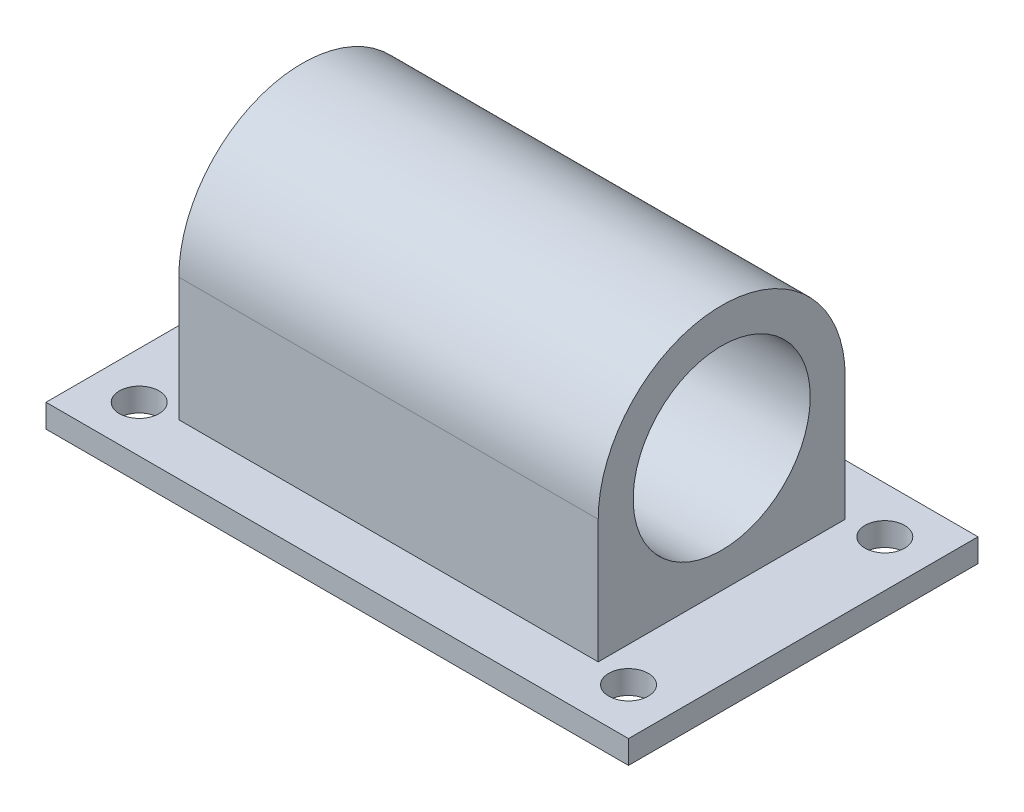
ISO-10303-21;
HEADER;
FILE_DESCRIPTION(('STEP AP214'),'2;1');
FILE_NAME('part.step','',(''),(''),'','','');
FILE_SCHEMA(('AUTOMOTIVE_DESIGN { 1 0 10303 214 1 1 1 1 }'));
ENDSEC;
DATA;
#1=APPLICATION_CONTEXT('core data for automotive mechanical design processes');
#2=APPLICATION_PROTOCOL_DEFINITION('international standard','automotive_design',2000,#1);
#3=PRODUCT_CONTEXT('',#1,'mechanical');
#4=PRODUCT('Part','Part','',(#3));
#5=PRODUCT_RELATED_PRODUCT_CATEGORY('part','',(#4));
#6=PRODUCT_DEFINITION_FORMATION('','',#4);
#7=PRODUCT_DEFINITION_CONTEXT('part definition',#1,'design');
#8=PRODUCT_DEFINITION('design','',#6,#7);
#9=PRODUCT_DEFINITION_SHAPE('','',#8);
#10=(LENGTH_UNIT() NAMED_UNIT(*) SI_UNIT(.MILLI.,.METRE.));
#11=(NAMED_UNIT(*) PLANE_ANGLE_UNIT() SI_UNIT($,.RADIAN.));
#12=(NAMED_UNIT(*) SI_UNIT($,.STERADIAN.) SOLID_ANGLE_UNIT());
#13=UNCERTAINTY_MEASURE_WITH_UNIT(LENGTH_MEASURE(1.E-05),#10,'distance_accuracy_value','');
#14=(GEOMETRIC_REPRESENTATION_CONTEXT(3) GLOBAL_UNCERTAINTY_ASSIGNED_CONTEXT((#13)) GLOBAL_UNIT_ASSIGNED_CONTEXT((#10,
#11,#12)) REPRESENTATION_CONTEXT('',''));
#15=CARTESIAN_POINT('',(0.,0.,0.));
#16=DIRECTION('',(0.,0.,1.));
#17=DIRECTION('',(1.,0.,0.));
#18=AXIS2_PLACEMENT_3D('',#15,#16,#17);
#19=CARTESIAN_POINT('',(18.,12.6,0.));
#20=DIRECTION('',(1.,0.,0.));
#21=DIRECTION('',(0.,0.,-1.));
#22=AXIS2_PLACEMENT_3D('',#19,#20,#21);
#23=PLANE('',#22);
#24=CARTESIAN_POINT('',(18.,12.6,0.));
#25=DIRECTION('',(1.,0.,0.));
#26=DIRECTION('',(0.,0.,-1.));
#27=AXIS2_PLACEMENT_3D('',#24,#25,#26);
#28=CIRCLE('',#27,10.6);
#29=CARTESIAN_POINT('',(18.,12.6,-10.6));
#30=VERTEX_POINT('',#29);
#31=CARTESIAN_POINT('',(18.,12.6,10.6));
#32=VERTEX_POINT('',#31);
#33=EDGE_CURVE('E94',#30,#32,#28,.T.);
#34=ORIENTED_EDGE('',*,*,#33,.T.);
#35=DIRECTION('',(0.,-1.,0.));
#36=VECTOR('',#35,1.);
#37=CARTESIAN_POINT('',(18.,12.6,10.6));
#38=LINE('',#37,#36);
#39=CARTESIAN_POINT('',(18.,2.,10.6));
#40=VERTEX_POINT('',#39);
#41=EDGE_CURVE('E89',#32,#40,#38,.T.);
#42=ORIENTED_EDGE('',*,*,#41,.T.);
#43=DIRECTION('',(0.,0.,-1.));
#44=VECTOR('',#43,1.);
#45=CARTESIAN_POINT('',(18.,2.,10.6));
#46=LINE('',#45,#44);
#47=CARTESIAN_POINT('',(18.,2.,-10.6));
#48=VERTEX_POINT('',#47);
#49=EDGE_CURVE('E92',#40,#48,#46,.T.);
#50=ORIENTED_EDGE('',*,*,#49,.T.);
#51=DIRECTION('',(0.,1.,0.));
#52=VECTOR('',#51,1.);
#53=CARTESIAN_POINT('',(18.,12.6,-10.6));
#54=LINE('',#53,#52);
#55=EDGE_CURVE('E59',#48,#30,#54,.T.);
#56=ORIENTED_EDGE('',*,*,#55,.T.);
#57=EDGE_LOOP('',(#34,#42,#50,#56));
#58=FACE_BOUND('',#57,.T.);
#59=CARTESIAN_POINT('',(18.,12.6,0.));
#60=DIRECTION('',(1.,0.,0.));
#61=DIRECTION('',(0.,0.,-1.));
#62=AXIS2_PLACEMENT_3D('',#59,#60,#61);
#63=CIRCLE('',#62,7.6);
#64=CARTESIAN_POINT('',(18.,12.6,-7.6));
#65=VERTEX_POINT('',#64);
#66=EDGE_CURVE('E109',#65,#65,#63,.T.);
#67=ORIENTED_EDGE('',*,*,#66,.F.);
#68=EDGE_LOOP('',(#67));
#69=FACE_BOUND('',#68,.T.);
#70=ADVANCED_FACE('F42',(#58,#69),#23,.T.);
#71=CARTESIAN_POINT('',(-18.,12.6,0.));
#72=DIRECTION('',(1.,0.,0.));
#73=DIRECTION('',(0.,0.,-1.));
#74=AXIS2_PLACEMENT_3D('',#71,#72,#73);
#75=PLANE('',#74);
#76=CARTESIAN_POINT('',(-18.,12.6,0.));
#77=DIRECTION('',(1.,0.,0.));
#78=DIRECTION('',(0.,0.,-1.));
#79=AXIS2_PLACEMENT_3D('',#76,#77,#78);
#80=CIRCLE('',#79,10.6);
#81=CARTESIAN_POINT('',(-18.,12.6,-10.6));
#82=VERTEX_POINT('',#81);
#83=CARTESIAN_POINT('',(-18.,12.6,10.6));
#84=VERTEX_POINT('',#83);
#85=EDGE_CURVE('E106',#82,#84,#80,.T.);
#86=ORIENTED_EDGE('',*,*,#85,.F.);
#87=DIRECTION('',(0.,1.,0.));
#88=VECTOR('',#87,1.);
#89=CARTESIAN_POINT('',(-18.,12.6,-10.6));
#90=LINE('',#89,#88);
#91=CARTESIAN_POINT('',(-18.,2.,-10.6));
#92=VERTEX_POINT('',#91);
#93=EDGE_CURVE('E82',#92,#82,#90,.T.);
#94=ORIENTED_EDGE('',*,*,#93,.F.);
#95=DIRECTION('',(0.,0.,-1.));
#96=VECTOR('',#95,1.);
#97=CARTESIAN_POINT('',(-18.,2.,10.6));
#98=LINE('',#97,#96);
#99=CARTESIAN_POINT('',(-18.,2.,10.6));
#100=VERTEX_POINT('',#99);
#101=EDGE_CURVE('E76',#100,#92,#98,.T.);
#102=ORIENTED_EDGE('',*,*,#101,.F.);
#103=DIRECTION('',(0.,-1.,0.));
#104=VECTOR('',#103,1.);
#105=CARTESIAN_POINT('',(-18.,12.6,10.6));
#106=LINE('',#105,#104);
#107=EDGE_CURVE('E98',#84,#100,#106,.T.);
#108=ORIENTED_EDGE('',*,*,#107,.F.);
#109=EDGE_LOOP('',(#86,#94,#102,#108));
#110=FACE_BOUND('',#109,.T.);
#111=CARTESIAN_POINT('',(-18.,12.6,0.));
#112=DIRECTION('',(1.,0.,0.));
#113=DIRECTION('',(0.,0.,-1.));
#114=AXIS2_PLACEMENT_3D('',#111,#112,#113);
#115=CIRCLE('',#114,7.6);
#116=CARTESIAN_POINT('',(-18.,12.6,-7.6));
#117=VERTEX_POINT('',#116);
#118=EDGE_CURVE('E121',#117,#117,#115,.T.);
#119=ORIENTED_EDGE('',*,*,#118,.T.);
#120=EDGE_LOOP('',(#119));
#121=FACE_BOUND('',#120,.T.);
#122=ADVANCED_FACE('F117',(#110,#121),#75,.F.);
#123=CARTESIAN_POINT('',(18.,12.6,0.));
#124=DIRECTION('',(-1.,0.,0.));
#125=DIRECTION('',(0.,0.,1.));
#126=AXIS2_PLACEMENT_3D('',#123,#124,#125);
#127=CYLINDRICAL_SURFACE('',#126,10.6);
#128=ORIENTED_EDGE('',*,*,#85,.T.);
#129=DIRECTION('',(-1.,0.,0.));
#130=VECTOR('',#129,1.);
#131=CARTESIAN_POINT('',(18.,12.6,10.6));
#132=LINE('',#131,#130);
#133=EDGE_CURVE('E12',#32,#84,#132,.T.);
#134=ORIENTED_EDGE('',*,*,#133,.F.);
#135=ORIENTED_EDGE('',*,*,#33,.F.);
#136=DIRECTION('',(-1.,0.,0.));
#137=VECTOR('',#136,1.);
#138=CARTESIAN_POINT('',(18.,12.6,-10.6));
#139=LINE('',#138,#137);
#140=EDGE_CURVE('E102',#30,#82,#139,.T.);
#141=ORIENTED_EDGE('',*,*,#140,.T.);
#142=EDGE_LOOP('',(#128,#134,#135,#141));
#143=FACE_BOUND('',#142,.T.);
#144=ADVANCED_FACE('F44',(#143),#127,.T.);
#145=CARTESIAN_POINT('',(18.,12.6,10.6));
#146=DIRECTION('',(0.,0.,-1.));
#147=DIRECTION('',(-1.,0.,0.));
#148=AXIS2_PLACEMENT_3D('',#145,#146,#147);
#149=PLANE('',#148);
#150=ORIENTED_EDGE('',*,*,#107,.T.);
#151=DIRECTION('',(-1.,0.,0.));
#152=VECTOR('',#151,1.);
#153=CARTESIAN_POINT('',(18.,2.,10.6));
#154=LINE('',#153,#152);
#155=EDGE_CURVE('E51',#40,#100,#154,.T.);
#156=ORIENTED_EDGE('',*,*,#155,.F.);
#157=ORIENTED_EDGE('',*,*,#41,.F.);
#158=ORIENTED_EDGE('',*,*,#133,.T.);
#159=EDGE_LOOP('',(#150,#156,#157,#158));
#160=FACE_BOUND('',#159,.T.);
#161=ADVANCED_FACE('F97',(#160),#149,.F.);
#162=CARTESIAN_POINT('',(18.,2.,10.6));
#163=DIRECTION('',(0.,1.,0.));
#164=DIRECTION('',(0.,0.,1.));
#165=AXIS2_PLACEMENT_3D('',#162,#163,#164);
#166=PLANE('',#165);
#167=ORIENTED_EDGE('',*,*,#101,.T.);
#168=DIRECTION('',(-1.,0.,0.));
#169=VECTOR('',#168,1.);
#170=CARTESIAN_POINT('',(18.,2.,-10.6));
#171=LINE('',#170,#169);
#172=EDGE_CURVE('E99',#48,#92,#171,.T.);
#173=ORIENTED_EDGE('',*,*,#172,.F.);
#174=ORIENTED_EDGE('',*,*,#49,.F.);
#175=ORIENTED_EDGE('',*,*,#155,.T.);
#176=EDGE_LOOP('',(#167,#173,#174,#175));
#177=FACE_BOUND('',#176,.T.);
#178=ADVANCED_FACE('F100',(#177),#166,.F.);
#179=CARTESIAN_POINT('',(18.,12.6,-10.6));
#180=DIRECTION('',(0.,0.,1.));
#181=DIRECTION('',(1.,0.,0.));
#182=AXIS2_PLACEMENT_3D('',#179,#180,#181);
#183=PLANE('',#182);
#184=ORIENTED_EDGE('',*,*,#93,.T.);
#185=ORIENTED_EDGE('',*,*,#140,.F.);
#186=ORIENTED_EDGE('',*,*,#55,.F.);
#187=ORIENTED_EDGE('',*,*,#172,.T.);
#188=EDGE_LOOP('',(#184,#185,#186,#187));
#189=FACE_BOUND('',#188,.T.);
#190=ADVANCED_FACE('F114',(#189),#183,.F.);
#191=CARTESIAN_POINT('',(18.,12.6,0.));
#192=DIRECTION('',(-1.,0.,0.));
#193=DIRECTION('',(0.,0.,1.));
#194=AXIS2_PLACEMENT_3D('',#191,#192,#193);
#195=CYLINDRICAL_SURFACE('',#194,7.6);
#196=ORIENTED_EDGE('',*,*,#66,.T.);
#197=EDGE_LOOP('',(#196));
#198=FACE_BOUND('',#197,.T.);
#199=ORIENTED_EDGE('',*,*,#118,.F.);
#200=EDGE_LOOP('',(#199));
#201=FACE_BOUND('',#200,.T.);
#202=ADVANCED_FACE('F127',(#198,#201),#195,.F.);
#203=CLOSED_SHELL('',(#70,#122,#144,#161,#178,#190,#202));
#204=MANIFOLD_SOLID_BREP('B2',#203);
#205=CARTESIAN_POINT('',(-25.,2.,-15.));
#206=DIRECTION('',(1.,0.,0.));
#207=DIRECTION('',(0.,0.,-1.));
#208=AXIS2_PLACEMENT_3D('',#205,#206,#207);
#209=PLANE('',#208);
#210=DIRECTION('',(0.,0.,1.));
#211=VECTOR('',#210,1.);
#212=CARTESIAN_POINT('',(-25.,0.,-15.));
#213=LINE('',#212,#211);
#214=CARTESIAN_POINT('',(-25.,0.,-15.));
#215=VERTEX_POINT('',#214);
#216=CARTESIAN_POINT('',(-25.,0.,15.));
#217=VERTEX_POINT('',#216);
#218=EDGE_CURVE('E249',#215,#217,#213,.T.);
#219=ORIENTED_EDGE('',*,*,#218,.T.);
#220=DIRECTION('',(0.,-1.,0.));
#221=VECTOR('',#220,1.);
#222=CARTESIAN_POINT('',(-25.,2.,15.));
#223=LINE('',#222,#221);
#224=CARTESIAN_POINT('',(-25.,2.,15.));
#225=VERTEX_POINT('',#224);
#226=EDGE_CURVE('E40',#225,#217,#223,.T.);
#227=ORIENTED_EDGE('',*,*,#226,.F.);
#228=DIRECTION('',(0.,0.,1.));
#229=VECTOR('',#228,1.);
#230=CARTESIAN_POINT('',(-25.,2.,-15.));
#231=LINE('',#230,#229);
#232=CARTESIAN_POINT('',(-25.,2.,-15.));
#233=VERTEX_POINT('',#232);
#234=EDGE_CURVE('E237',#233,#225,#231,.T.);
#235=ORIENTED_EDGE('',*,*,#234,.F.);
#236=DIRECTION('',(0.,-1.,0.));
#237=VECTOR('',#236,1.);
#238=CARTESIAN_POINT('',(-25.,2.,-15.));
#239=LINE('',#238,#237);
#240=EDGE_CURVE('E245',#233,#215,#239,.T.);
#241=ORIENTED_EDGE('',*,*,#240,.T.);
#242=EDGE_LOOP('',(#219,#227,#235,#241));
#243=FACE_BOUND('',#242,.T.);
#244=ADVANCED_FACE('F186',(#243),#209,.F.);
#245=CARTESIAN_POINT('',(-25.,2.,15.));
#246=DIRECTION('',(0.,0.,-1.));
#247=DIRECTION('',(-1.,0.,0.));
#248=AXIS2_PLACEMENT_3D('',#245,#246,#247);
#249=PLANE('',#248);
#250=DIRECTION('',(1.,0.,0.));
#251=VECTOR('',#250,1.);
#252=CARTESIAN_POINT('',(-25.,0.,15.));
#253=LINE('',#252,#251);
#254=CARTESIAN_POINT('',(25.,0.,15.));
#255=VERTEX_POINT('',#254);
#256=EDGE_CURVE('E241',#217,#255,#253,.T.);
#257=ORIENTED_EDGE('',*,*,#256,.T.);
#258=DIRECTION('',(0.,-1.,0.));
#259=VECTOR('',#258,1.);
#260=CARTESIAN_POINT('',(25.,2.,15.));
#261=LINE('',#260,#259);
#262=CARTESIAN_POINT('',(25.,2.,15.));
#263=VERTEX_POINT('',#262);
#264=EDGE_CURVE('E194',#263,#255,#261,.T.);
#265=ORIENTED_EDGE('',*,*,#264,.F.);
#266=DIRECTION('',(1.,0.,0.));
#267=VECTOR('',#266,1.);
#268=CARTESIAN_POINT('',(-25.,2.,15.));
#269=LINE('',#268,#267);
#270=EDGE_CURVE('E232',#225,#263,#269,.T.);
#271=ORIENTED_EDGE('',*,*,#270,.F.);
#272=ORIENTED_EDGE('',*,*,#226,.T.);
#273=EDGE_LOOP('',(#257,#265,#271,#272));
#274=FACE_BOUND('',#273,.T.);
#275=ADVANCED_FACE('F240',(#274),#249,.F.);
#276=CARTESIAN_POINT('',(25.,2.,-15.));
#277=DIRECTION('',(-1.,0.,0.));
#278=DIRECTION('',(0.,0.,1.));
#279=AXIS2_PLACEMENT_3D('',#276,#277,#278);
#280=PLANE('',#279);
#281=DIRECTION('',(0.,0.,-1.));
#282=VECTOR('',#281,1.);
#283=CARTESIAN_POINT('',(25.,0.,-15.));
#284=LINE('',#283,#282);
#285=CARTESIAN_POINT('',(25.,0.,-15.));
#286=VERTEX_POINT('',#285);
#287=EDGE_CURVE('E219',#255,#286,#284,.T.);
#288=ORIENTED_EDGE('',*,*,#287,.T.);
#289=DIRECTION('',(0.,-1.,0.));
#290=VECTOR('',#289,1.);
#291=CARTESIAN_POINT('',(25.,2.,-15.));
#292=LINE('',#291,#290);
#293=CARTESIAN_POINT('',(25.,2.,-15.));
#294=VERTEX_POINT('',#293);
#295=EDGE_CURVE('E242',#294,#286,#292,.T.);
#296=ORIENTED_EDGE('',*,*,#295,.F.);
#297=DIRECTION('',(0.,0.,-1.));
#298=VECTOR('',#297,1.);
#299=CARTESIAN_POINT('',(25.,2.,-15.));
#300=LINE('',#299,#298);
#301=EDGE_CURVE('E235',#263,#294,#300,.T.);
#302=ORIENTED_EDGE('',*,*,#301,.F.);
#303=ORIENTED_EDGE('',*,*,#264,.T.);
#304=EDGE_LOOP('',(#288,#296,#302,#303));
#305=FACE_BOUND('',#304,.T.);
#306=ADVANCED_FACE('F243',(#305),#280,.F.);
#307=CARTESIAN_POINT('',(-25.,2.,-15.));
#308=DIRECTION('',(0.,0.,1.));
#309=DIRECTION('',(1.,0.,0.));
#310=AXIS2_PLACEMENT_3D('',#307,#308,#309);
#311=PLANE('',#310);
#312=DIRECTION('',(-1.,0.,0.));
#313=VECTOR('',#312,1.);
#314=CARTESIAN_POINT('',(-25.,0.,-15.));
#315=LINE('',#314,#313);
#316=EDGE_CURVE('E225',#286,#215,#315,.T.);
#317=ORIENTED_EDGE('',*,*,#316,.T.);
#318=ORIENTED_EDGE('',*,*,#240,.F.);
#319=DIRECTION('',(-1.,0.,0.));
#320=VECTOR('',#319,1.);
#321=CARTESIAN_POINT('',(-25.,2.,-15.));
#322=LINE('',#321,#320);
#323=EDGE_CURVE('E202',#294,#233,#322,.T.);
#324=ORIENTED_EDGE('',*,*,#323,.F.);
#325=ORIENTED_EDGE('',*,*,#295,.T.);
#326=EDGE_LOOP('',(#317,#318,#324,#325));
#327=FACE_BOUND('',#326,.T.);
#328=ADVANCED_FACE('F257',(#327),#311,.F.);
#329=CARTESIAN_POINT('',(0.,2.,0.));
#330=DIRECTION('',(0.,1.,0.));
#331=DIRECTION('',(0.,0.,1.));
#332=AXIS2_PLACEMENT_3D('',#329,#330,#331);
#333=PLANE('',#332);
#334=CARTESIAN_POINT('',(21.,2.,11.));
#335=DIRECTION('',(0.,1.,0.));
#336=DIRECTION('',(0.,0.,1.));
#337=AXIS2_PLACEMENT_3D('',#334,#335,#336);
#338=CIRCLE('',#337,1.7);
#339=CARTESIAN_POINT('',(21.,2.,12.7));
#340=VERTEX_POINT('',#339);
#341=EDGE_CURVE('E281',#340,#340,#338,.T.);
#342=ORIENTED_EDGE('',*,*,#341,.F.);
#343=EDGE_LOOP('',(#342));
#344=FACE_BOUND('',#343,.T.);
#345=CARTESIAN_POINT('',(-21.,2.,11.));
#346=DIRECTION('',(0.,1.,0.));
#347=DIRECTION('',(0.,0.,-1.));
#348=AXIS2_PLACEMENT_3D('',#345,#346,#347);
#349=CIRCLE('',#348,1.7);
#350=CARTESIAN_POINT('',(-21.,2.,9.3));
#351=VERTEX_POINT('',#350);
#352=EDGE_CURVE('E275',#351,#351,#349,.T.);
#353=ORIENTED_EDGE('',*,*,#352,.F.);
#354=EDGE_LOOP('',(#353));
#355=FACE_BOUND('',#354,.T.);
#356=CARTESIAN_POINT('',(21.,2.,-11.));
#357=DIRECTION('',(0.,1.,0.));
#358=DIRECTION('',(0.,0.,-1.));
#359=AXIS2_PLACEMENT_3D('',#356,#357,#358);
#360=CIRCLE('',#359,1.7);
#361=CARTESIAN_POINT('',(21.,2.,-12.7));
#362=VERTEX_POINT('',#361);
#363=EDGE_CURVE('E269',#362,#362,#360,.T.);
#364=ORIENTED_EDGE('',*,*,#363,.F.);
#365=EDGE_LOOP('',(#364));
#366=FACE_BOUND('',#365,.T.);
#367=CARTESIAN_POINT('',(-21.,2.,-11.));
#368=DIRECTION('',(0.,1.,0.));
#369=DIRECTION('',(0.,0.,1.));
#370=AXIS2_PLACEMENT_3D('',#367,#368,#369);
#371=CIRCLE('',#370,1.7);
#372=CARTESIAN_POINT('',(-21.,2.,-9.3));
#373=VERTEX_POINT('',#372);
#374=EDGE_CURVE('E263',#373,#373,#371,.T.);
#375=ORIENTED_EDGE('',*,*,#374,.F.);
#376=EDGE_LOOP('',(#375));
#377=FACE_BOUND('',#376,.T.);
#378=ORIENTED_EDGE('',*,*,#234,.T.);
#379=ORIENTED_EDGE('',*,*,#270,.T.);
#380=ORIENTED_EDGE('',*,*,#301,.T.);
#381=ORIENTED_EDGE('',*,*,#323,.T.);
#382=EDGE_LOOP('',(#378,#379,#380,#381));
#383=FACE_BOUND('',#382,.T.);
#384=ADVANCED_FACE('F233',(#344,#355,#366,#377,#383),#333,.T.);
#385=CARTESIAN_POINT('',(0.,0.,0.));
#386=DIRECTION('',(0.,1.,0.));
#387=DIRECTION('',(0.,0.,1.));
#388=AXIS2_PLACEMENT_3D('',#385,#386,#387);
#389=PLANE('',#388);
#390=CARTESIAN_POINT('',(21.,0.,11.));
#391=DIRECTION('',(0.,1.,0.));
#392=DIRECTION('',(0.,0.,1.));
#393=AXIS2_PLACEMENT_3D('',#390,#391,#392);
#394=CIRCLE('',#393,1.7);
#395=CARTESIAN_POINT('',(21.,0.,12.7));
#396=VERTEX_POINT('',#395);
#397=EDGE_CURVE('E278',#396,#396,#394,.T.);
#398=ORIENTED_EDGE('',*,*,#397,.T.);
#399=EDGE_LOOP('',(#398));
#400=FACE_BOUND('',#399,.T.);
#401=CARTESIAN_POINT('',(-21.,0.,11.));
#402=DIRECTION('',(0.,1.,0.));
#403=DIRECTION('',(0.,0.,-1.));
#404=AXIS2_PLACEMENT_3D('',#401,#402,#403);
#405=CIRCLE('',#404,1.7);
#406=CARTESIAN_POINT('',(-21.,0.,9.3));
#407=VERTEX_POINT('',#406);
#408=EDGE_CURVE('E272',#407,#407,#405,.T.);
#409=ORIENTED_EDGE('',*,*,#408,.T.);
#410=EDGE_LOOP('',(#409));
#411=FACE_BOUND('',#410,.T.);
#412=CARTESIAN_POINT('',(21.,0.,-11.));
#413=DIRECTION('',(0.,1.,0.));
#414=DIRECTION('',(0.,0.,-1.));
#415=AXIS2_PLACEMENT_3D('',#412,#413,#414);
#416=CIRCLE('',#415,1.7);
#417=CARTESIAN_POINT('',(21.,0.,-12.7));
#418=VERTEX_POINT('',#417);
#419=EDGE_CURVE('E266',#418,#418,#416,.T.);
#420=ORIENTED_EDGE('',*,*,#419,.T.);
#421=EDGE_LOOP('',(#420));
#422=FACE_BOUND('',#421,.T.);
#423=CARTESIAN_POINT('',(-21.,0.,-11.));
#424=DIRECTION('',(0.,1.,0.));
#425=DIRECTION('',(0.,0.,1.));
#426=AXIS2_PLACEMENT_3D('',#423,#424,#425);
#427=CIRCLE('',#426,1.7);
#428=CARTESIAN_POINT('',(-21.,0.,-9.3));
#429=VERTEX_POINT('',#428);
#430=EDGE_CURVE('E252',#429,#429,#427,.T.);
#431=ORIENTED_EDGE('',*,*,#430,.T.);
#432=EDGE_LOOP('',(#431));
#433=FACE_BOUND('',#432,.T.);
#434=ORIENTED_EDGE('',*,*,#218,.F.);
#435=ORIENTED_EDGE('',*,*,#316,.F.);
#436=ORIENTED_EDGE('',*,*,#287,.F.);
#437=ORIENTED_EDGE('',*,*,#256,.F.);
#438=EDGE_LOOP('',(#434,#435,#436,#437));
#439=FACE_BOUND('',#438,.T.);
#440=ADVANCED_FACE('F260',(#400,#411,#422,#433,#439),#389,.F.);
#441=CARTESIAN_POINT('',(-21.,0.,-11.));
#442=DIRECTION('',(0.,1.,0.));
#443=DIRECTION('',(0.,0.,1.));
#444=AXIS2_PLACEMENT_3D('',#441,#442,#443);
#445=CYLINDRICAL_SURFACE('',#444,1.7);
#446=ORIENTED_EDGE('',*,*,#430,.F.);
#447=EDGE_LOOP('',(#446));
#448=FACE_BOUND('',#447,.T.);
#449=ORIENTED_EDGE('',*,*,#374,.T.);
#450=EDGE_LOOP('',(#449));
#451=FACE_BOUND('',#450,.T.);
#452=ADVANCED_FACE('F305',(#448,#451),#445,.F.);
#453=CARTESIAN_POINT('',(21.,0.,-11.));
#454=DIRECTION('',(0.,1.,0.));
#455=DIRECTION('',(0.,0.,1.));
#456=AXIS2_PLACEMENT_3D('',#453,#454,#455);
#457=CYLINDRICAL_SURFACE('',#456,1.7);
#458=ORIENTED_EDGE('',*,*,#419,.F.);
#459=EDGE_LOOP('',(#458));
#460=FACE_BOUND('',#459,.T.);
#461=ORIENTED_EDGE('',*,*,#363,.T.);
#462=EDGE_LOOP('',(#461));
#463=FACE_BOUND('',#462,.T.);
#464=ADVANCED_FACE('F307',(#460,#463),#457,.F.);
#465=CARTESIAN_POINT('',(-21.,0.,11.));
#466=DIRECTION('',(0.,1.,0.));
#467=DIRECTION('',(0.,0.,1.));
#468=AXIS2_PLACEMENT_3D('',#465,#466,#467);
#469=CYLINDRICAL_SURFACE('',#468,1.7);
#470=ORIENTED_EDGE('',*,*,#408,.F.);
#471=EDGE_LOOP('',(#470));
#472=FACE_BOUND('',#471,.T.);
#473=ORIENTED_EDGE('',*,*,#352,.T.);
#474=EDGE_LOOP('',(#473));
#475=FACE_BOUND('',#474,.T.);
#476=ADVANCED_FACE('F292',(#472,#475),#469,.F.);
#477=CARTESIAN_POINT('',(21.,0.,11.));
#478=DIRECTION('',(0.,1.,0.));
#479=DIRECTION('',(0.,0.,1.));
#480=AXIS2_PLACEMENT_3D('',#477,#478,#479);
#481=CYLINDRICAL_SURFACE('',#480,1.7);
#482=ORIENTED_EDGE('',*,*,#397,.F.);
#483=EDGE_LOOP('',(#482));
#484=FACE_BOUND('',#483,.T.);
#485=ORIENTED_EDGE('',*,*,#341,.T.);
#486=EDGE_LOOP('',(#485));
#487=FACE_BOUND('',#486,.T.);
#488=ADVANCED_FACE('F289',(#484,#487),#481,.F.);
#489=CLOSED_SHELL('',(#244,#275,#306,#328,#384,#440,#452,#464,#476,#488));
#490=MANIFOLD_SOLID_BREP('B6',#489);
#491=ADVANCED_BREP_SHAPE_REPRESENTATION('',(#18,#204,#490),#14);
#492=SHAPE_DEFINITION_REPRESENTATION(#9,#491);
ENDSEC;
END-ISO-10303-21;
